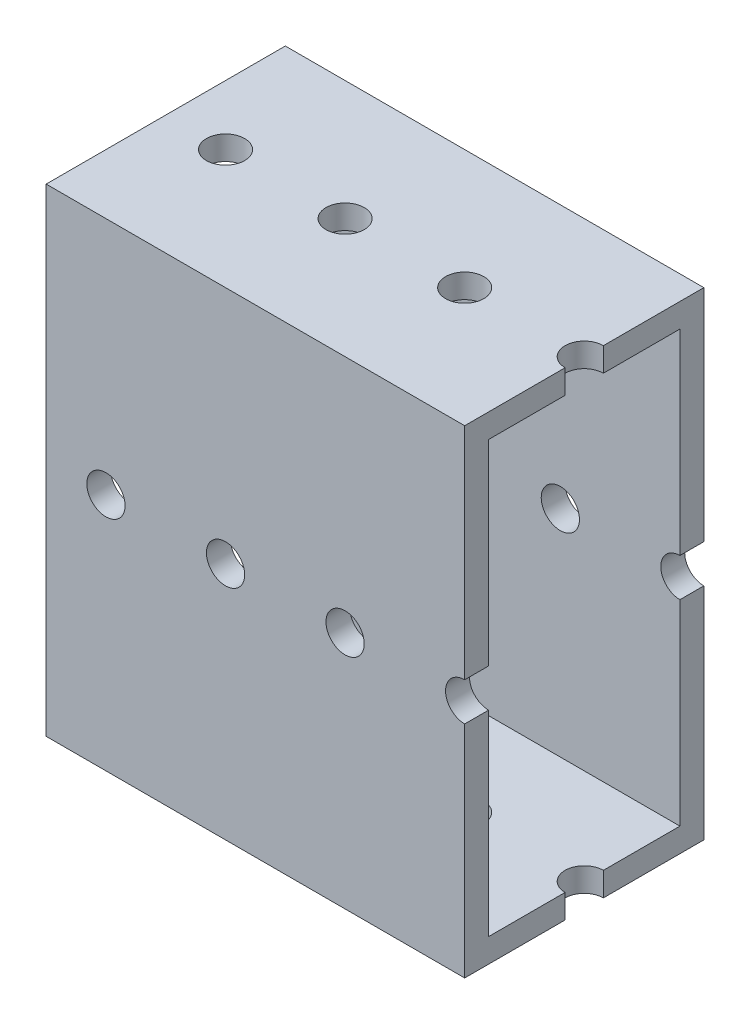
ISO-10303-21;
HEADER;
FILE_DESCRIPTION(('STEP AP214'),'2;1');
FILE_NAME('part.step','',(''),(''),'','','');
FILE_SCHEMA(('AUTOMOTIVE_DESIGN { 1 0 10303 214 1 1 1 1 }'));
ENDSEC;
DATA;
#1=APPLICATION_CONTEXT('core data for automotive mechanical design processes');
#2=APPLICATION_PROTOCOL_DEFINITION('international standard','automotive_design',2000,#1);
#3=PRODUCT_CONTEXT('',#1,'mechanical');
#4=PRODUCT('Part','Part','',(#3));
#5=PRODUCT_RELATED_PRODUCT_CATEGORY('part','',(#4));
#6=PRODUCT_DEFINITION_FORMATION('','',#4);
#7=PRODUCT_DEFINITION_CONTEXT('part definition',#1,'design');
#8=PRODUCT_DEFINITION('design','',#6,#7);
#9=PRODUCT_DEFINITION_SHAPE('','',#8);
#10=(LENGTH_UNIT() NAMED_UNIT(*) SI_UNIT(.MILLI.,.METRE.));
#11=(NAMED_UNIT(*) PLANE_ANGLE_UNIT() SI_UNIT($,.RADIAN.));
#12=(NAMED_UNIT(*) SI_UNIT($,.STERADIAN.) SOLID_ANGLE_UNIT());
#13=UNCERTAINTY_MEASURE_WITH_UNIT(LENGTH_MEASURE(1.E-05),#10,'distance_accuracy_value','');
#14=(GEOMETRIC_REPRESENTATION_CONTEXT(3) GLOBAL_UNCERTAINTY_ASSIGNED_CONTEXT((#13)) GLOBAL_UNIT_ASSIGNED_CONTEXT((#10,
#11,#12)) REPRESENTATION_CONTEXT('',''));
#15=CARTESIAN_POINT('',(0.,0.,0.));
#16=DIRECTION('',(0.,0.,1.));
#17=DIRECTION('',(1.,0.,0.));
#18=AXIS2_PLACEMENT_3D('',#15,#16,#17);
#19=CARTESIAN_POINT('',(44.45,0.,0.));
#20=DIRECTION('',(-1.,0.,0.));
#21=DIRECTION('',(0.,0.,1.));
#22=AXIS2_PLACEMENT_3D('',#19,#20,#21);
#23=PLANE('',#22);
#24=DIRECTION('',(0.,1.,0.));
#25=VECTOR('',#24,1.);
#26=CARTESIAN_POINT('',(44.45,-22.86,-10.16));
#27=LINE('',#26,#25);
#28=CARTESIAN_POINT('',(44.45,2.03200000000001,-10.16));
#29=VERTEX_POINT('',#28);
#30=CARTESIAN_POINT('',(44.45,22.86,-10.16));
#31=VERTEX_POINT('',#30);
#32=EDGE_CURVE('E284',#29,#31,#27,.T.);
#33=ORIENTED_EDGE('',*,*,#32,.F.);
#34=DIRECTION('',(0.,0.,-1.));
#35=VECTOR('',#34,1.);
#36=CARTESIAN_POINT('',(44.45,2.03200000000001,12.7));
#37=LINE('',#36,#35);
#38=CARTESIAN_POINT('',(44.45,2.03200000000001,-12.7));
#39=VERTEX_POINT('',#38);
#40=EDGE_CURVE('E54',#29,#39,#37,.T.);
#41=ORIENTED_EDGE('',*,*,#40,.T.);
#42=DIRECTION('',(0.,1.,0.));
#43=VECTOR('',#42,1.);
#44=CARTESIAN_POINT('',(44.45,-25.4,-12.7));
#45=LINE('',#44,#43);
#46=CARTESIAN_POINT('',(44.45,25.4,-12.7));
#47=VERTEX_POINT('',#46);
#48=EDGE_CURVE('E189',#39,#47,#45,.T.);
#49=ORIENTED_EDGE('',*,*,#48,.T.);
#50=DIRECTION('',(0.,0.,1.));
#51=VECTOR('',#50,1.);
#52=CARTESIAN_POINT('',(44.45,25.4,12.7));
#53=LINE('',#52,#51);
#54=CARTESIAN_POINT('',(44.45,25.4,-2.032));
#55=VERTEX_POINT('',#54);
#56=EDGE_CURVE('E173',#47,#55,#53,.T.);
#57=ORIENTED_EDGE('',*,*,#56,.T.);
#58=DIRECTION('',(0.,-1.,0.));
#59=VECTOR('',#58,1.);
#60=CARTESIAN_POINT('',(44.45,25.4,-2.032));
#61=LINE('',#60,#59);
#62=CARTESIAN_POINT('',(44.45,22.86,-2.032));
#63=VERTEX_POINT('',#62);
#64=EDGE_CURVE('E268',#55,#63,#61,.T.);
#65=ORIENTED_EDGE('',*,*,#64,.T.);
#66=DIRECTION('',(0.,0.,1.));
#67=VECTOR('',#66,1.);
#68=CARTESIAN_POINT('',(44.45,22.86,10.16));
#69=LINE('',#68,#67);
#70=EDGE_CURVE('E289',#31,#63,#69,.T.);
#71=ORIENTED_EDGE('',*,*,#70,.F.);
#72=EDGE_LOOP('',(#33,#41,#49,#57,#65,#71));
#73=FACE_BOUND('',#72,.T.);
#74=ADVANCED_FACE('F32',(#73),#23,.F.);
#75=DIRECTION('',(0.,-1.,0.));
#76=VECTOR('',#75,1.);
#77=CARTESIAN_POINT('',(44.45,-25.4,12.7));
#78=LINE('',#77,#76);
#79=CARTESIAN_POINT('',(44.45,25.4,12.7));
#80=VERTEX_POINT('',#79);
#81=CARTESIAN_POINT('',(44.45,2.03200000000001,12.7));
#82=VERTEX_POINT('',#81);
#83=EDGE_CURVE('E158',#80,#82,#78,.T.);
#84=ORIENTED_EDGE('',*,*,#83,.T.);
#85=DIRECTION('',(0.,0.,-1.));
#86=VECTOR('',#85,1.);
#87=CARTESIAN_POINT('',(44.45,2.03200000000001,12.7));
#88=LINE('',#87,#86);
#89=CARTESIAN_POINT('',(44.45,2.03200000000001,10.16));
#90=VERTEX_POINT('',#89);
#91=EDGE_CURVE('E142',#82,#90,#88,.T.);
#92=ORIENTED_EDGE('',*,*,#91,.T.);
#93=DIRECTION('',(0.,-1.,0.));
#94=VECTOR('',#93,1.);
#95=CARTESIAN_POINT('',(44.45,-22.86,10.16));
#96=LINE('',#95,#94);
#97=CARTESIAN_POINT('',(44.45,22.86,10.16));
#98=VERTEX_POINT('',#97);
#99=EDGE_CURVE('E277',#98,#90,#96,.T.);
#100=ORIENTED_EDGE('',*,*,#99,.F.);
#101=CARTESIAN_POINT('',(44.45,22.86,2.032));
#102=VERTEX_POINT('',#101);
#103=EDGE_CURVE('E288',#102,#98,#69,.T.);
#104=ORIENTED_EDGE('',*,*,#103,.F.);
#105=DIRECTION('',(0.,-1.,0.));
#106=VECTOR('',#105,1.);
#107=CARTESIAN_POINT('',(44.45,25.4,2.032));
#108=LINE('',#107,#106);
#109=CARTESIAN_POINT('',(44.45,25.4,2.032));
#110=VERTEX_POINT('',#109);
#111=EDGE_CURVE('E266',#102,#110,#108,.F.);
#112=ORIENTED_EDGE('',*,*,#111,.T.);
#113=EDGE_CURVE('E167',#110,#80,#53,.T.);
#114=ORIENTED_EDGE('',*,*,#113,.T.);
#115=EDGE_LOOP('',(#84,#92,#100,#104,#112,#114));
#116=FACE_BOUND('',#115,.T.);
#117=ADVANCED_FACE('F164',(#116),#23,.F.);
#118=CARTESIAN_POINT('',(44.45,-25.4,-12.7));
#119=VERTEX_POINT('',#118);
#120=CARTESIAN_POINT('',(44.45,-2.032,-12.7));
#121=VERTEX_POINT('',#120);
#122=EDGE_CURVE('E311',#119,#121,#45,.T.);
#123=ORIENTED_EDGE('',*,*,#122,.T.);
#124=DIRECTION('',(0.,0.,-1.));
#125=VECTOR('',#124,1.);
#126=CARTESIAN_POINT('',(44.45,-2.032,12.7));
#127=LINE('',#126,#125);
#128=CARTESIAN_POINT('',(44.45,-2.032,-10.16));
#129=VERTEX_POINT('',#128);
#130=EDGE_CURVE('E227',#121,#129,#127,.F.);
#131=ORIENTED_EDGE('',*,*,#130,.T.);
#132=CARTESIAN_POINT('',(44.45,-22.86,-10.16));
#133=VERTEX_POINT('',#132);
#134=EDGE_CURVE('E285',#133,#129,#27,.T.);
#135=ORIENTED_EDGE('',*,*,#134,.F.);
#136=DIRECTION('',(0.,0.,-1.));
#137=VECTOR('',#136,1.);
#138=CARTESIAN_POINT('',(44.45,-22.86,10.16));
#139=LINE('',#138,#137);
#140=CARTESIAN_POINT('',(44.45,-22.86,-2.032));
#141=VERTEX_POINT('',#140);
#142=EDGE_CURVE('E279',#141,#133,#139,.T.);
#143=ORIENTED_EDGE('',*,*,#142,.F.);
#144=CARTESIAN_POINT('',(44.45,-25.4,-2.032));
#145=VERTEX_POINT('',#144);
#146=EDGE_CURVE('E214',#141,#145,#61,.T.);
#147=ORIENTED_EDGE('',*,*,#146,.T.);
#148=DIRECTION('',(0.,0.,-1.));
#149=VECTOR('',#148,1.);
#150=CARTESIAN_POINT('',(44.45,-25.4,12.7));
#151=LINE('',#150,#149);
#152=EDGE_CURVE('E169',#145,#119,#151,.T.);
#153=ORIENTED_EDGE('',*,*,#152,.T.);
#154=EDGE_LOOP('',(#123,#131,#135,#143,#147,#153));
#155=FACE_BOUND('',#154,.T.);
#156=ADVANCED_FACE('F368',(#155),#23,.F.);
#157=CARTESIAN_POINT('',(44.45,-2.032,10.16));
#158=VERTEX_POINT('',#157);
#159=CARTESIAN_POINT('',(44.45,-22.86,10.16));
#160=VERTEX_POINT('',#159);
#161=EDGE_CURVE('E280',#158,#160,#96,.T.);
#162=ORIENTED_EDGE('',*,*,#161,.F.);
#163=DIRECTION('',(0.,0.,-1.));
#164=VECTOR('',#163,1.);
#165=CARTESIAN_POINT('',(44.45,-2.032,12.7));
#166=LINE('',#165,#164);
#167=CARTESIAN_POINT('',(44.45,-2.032,12.7));
#168=VERTEX_POINT('',#167);
#169=EDGE_CURVE('E47',#158,#168,#166,.F.);
#170=ORIENTED_EDGE('',*,*,#169,.T.);
#171=CARTESIAN_POINT('',(44.45,-25.4,12.7));
#172=VERTEX_POINT('',#171);
#173=EDGE_CURVE('E160',#168,#172,#78,.T.);
#174=ORIENTED_EDGE('',*,*,#173,.T.);
#175=CARTESIAN_POINT('',(44.45,-25.4,2.032));
#176=VERTEX_POINT('',#175);
#177=EDGE_CURVE('E171',#172,#176,#151,.T.);
#178=ORIENTED_EDGE('',*,*,#177,.T.);
#179=CARTESIAN_POINT('',(44.45,-22.86,2.032));
#180=VERTEX_POINT('',#179);
#181=EDGE_CURVE('E269',#176,#180,#108,.F.);
#182=ORIENTED_EDGE('',*,*,#181,.T.);
#183=EDGE_CURVE('E281',#160,#180,#139,.T.);
#184=ORIENTED_EDGE('',*,*,#183,.F.);
#185=EDGE_LOOP('',(#162,#170,#174,#178,#182,#184));
#186=FACE_BOUND('',#185,.T.);
#187=ADVANCED_FACE('F340',(#186),#23,.F.);
#188=CARTESIAN_POINT('',(0.,0.,0.));
#189=DIRECTION('',(-1.,0.,0.));
#190=DIRECTION('',(0.,0.,1.));
#191=AXIS2_PLACEMENT_3D('',#188,#189,#190);
#192=PLANE('',#191);
#193=DIRECTION('',(0.,1.,0.));
#194=VECTOR('',#193,1.);
#195=CARTESIAN_POINT('',(0.,-25.4,-12.7));
#196=LINE('',#195,#194);
#197=CARTESIAN_POINT('',(0.,-25.4,-12.7));
#198=VERTEX_POINT('',#197);
#199=CARTESIAN_POINT('',(0.,25.4,-12.7));
#200=VERTEX_POINT('',#199);
#201=EDGE_CURVE('E179',#198,#200,#196,.T.);
#202=ORIENTED_EDGE('',*,*,#201,.F.);
#203=DIRECTION('',(0.,0.,-1.));
#204=VECTOR('',#203,1.);
#205=CARTESIAN_POINT('',(0.,-25.4,12.7));
#206=LINE('',#205,#204);
#207=CARTESIAN_POINT('',(0.,-25.4,12.7));
#208=VERTEX_POINT('',#207);
#209=EDGE_CURVE('E187',#208,#198,#206,.T.);
#210=ORIENTED_EDGE('',*,*,#209,.F.);
#211=DIRECTION('',(0.,-1.,0.));
#212=VECTOR('',#211,1.);
#213=CARTESIAN_POINT('',(0.,-25.4,12.7));
#214=LINE('',#213,#212);
#215=CARTESIAN_POINT('',(0.,25.4,12.7));
#216=VERTEX_POINT('',#215);
#217=EDGE_CURVE('E185',#216,#208,#214,.T.);
#218=ORIENTED_EDGE('',*,*,#217,.F.);
#219=DIRECTION('',(0.,0.,1.));
#220=VECTOR('',#219,1.);
#221=CARTESIAN_POINT('',(0.,25.4,12.7));
#222=LINE('',#221,#220);
#223=EDGE_CURVE('E182',#200,#216,#222,.T.);
#224=ORIENTED_EDGE('',*,*,#223,.F.);
#225=EDGE_LOOP('',(#202,#210,#218,#224));
#226=FACE_BOUND('',#225,.T.);
#227=DIRECTION('',(0.,0.,1.));
#228=VECTOR('',#227,1.);
#229=CARTESIAN_POINT('',(0.,22.86,10.16));
#230=LINE('',#229,#228);
#231=CARTESIAN_POINT('',(0.,22.86,-10.16));
#232=VERTEX_POINT('',#231);
#233=CARTESIAN_POINT('',(0.,22.86,10.16));
#234=VERTEX_POINT('',#233);
#235=EDGE_CURVE('E301',#232,#234,#230,.T.);
#236=ORIENTED_EDGE('',*,*,#235,.T.);
#237=DIRECTION('',(0.,-1.,0.));
#238=VECTOR('',#237,1.);
#239=CARTESIAN_POINT('',(0.,-22.86,10.16));
#240=LINE('',#239,#238);
#241=CARTESIAN_POINT('',(0.,-22.86,10.16));
#242=VERTEX_POINT('',#241);
#243=EDGE_CURVE('E276',#234,#242,#240,.T.);
#244=ORIENTED_EDGE('',*,*,#243,.T.);
#245=DIRECTION('',(0.,0.,-1.));
#246=VECTOR('',#245,1.);
#247=CARTESIAN_POINT('',(0.,-22.86,10.16));
#248=LINE('',#247,#246);
#249=CARTESIAN_POINT('',(0.,-22.86,-10.16));
#250=VERTEX_POINT('',#249);
#251=EDGE_CURVE('E295',#242,#250,#248,.T.);
#252=ORIENTED_EDGE('',*,*,#251,.T.);
#253=DIRECTION('',(0.,1.,0.));
#254=VECTOR('',#253,1.);
#255=CARTESIAN_POINT('',(0.,-22.86,-10.16));
#256=LINE('',#255,#254);
#257=EDGE_CURVE('E298',#250,#232,#256,.T.);
#258=ORIENTED_EDGE('',*,*,#257,.T.);
#259=EDGE_LOOP('',(#236,#244,#252,#258));
#260=FACE_BOUND('',#259,.T.);
#261=ADVANCED_FACE('F329',(#226,#260),#192,.T.);
#262=CARTESIAN_POINT('',(44.45,-25.4,-12.7));
#263=DIRECTION('',(0.,0.,1.));
#264=DIRECTION('',(1.,0.,0.));
#265=AXIS2_PLACEMENT_3D('',#262,#263,#264);
#266=PLANE('',#265);
#267=CARTESIAN_POINT('',(31.75,0.,-12.7));
#268=DIRECTION('',(0.,0.,-1.));
#269=DIRECTION('',(-1.,0.,0.));
#270=AXIS2_PLACEMENT_3D('',#267,#268,#269);
#271=CIRCLE('',#270,2.03200000000001);
#272=CARTESIAN_POINT('',(29.718,0.,-12.7));
#273=VERTEX_POINT('',#272);
#274=EDGE_CURVE('E621',#273,#273,#271,.T.);
#275=ORIENTED_EDGE('',*,*,#274,.F.);
#276=EDGE_LOOP('',(#275));
#277=FACE_BOUND('',#276,.T.);
#278=CARTESIAN_POINT('',(19.05,0.,-12.7));
#279=DIRECTION('',(0.,0.,-1.));
#280=DIRECTION('',(-1.,0.,0.));
#281=AXIS2_PLACEMENT_3D('',#278,#279,#280);
#282=CIRCLE('',#281,2.032);
#283=CARTESIAN_POINT('',(17.018,0.,-12.7));
#284=VERTEX_POINT('',#283);
#285=EDGE_CURVE('E630',#284,#284,#282,.T.);
#286=ORIENTED_EDGE('',*,*,#285,.F.);
#287=EDGE_LOOP('',(#286));
#288=FACE_BOUND('',#287,.T.);
#289=CARTESIAN_POINT('',(6.35000000000002,0.,-12.7));
#290=DIRECTION('',(0.,0.,-1.));
#291=DIRECTION('',(-1.,0.,0.));
#292=AXIS2_PLACEMENT_3D('',#289,#290,#291);
#293=CIRCLE('',#292,2.032);
#294=CARTESIAN_POINT('',(4.31800000000002,0.,-12.7));
#295=VERTEX_POINT('',#294);
#296=EDGE_CURVE('E635',#295,#295,#293,.T.);
#297=ORIENTED_EDGE('',*,*,#296,.F.);
#298=EDGE_LOOP('',(#297));
#299=FACE_BOUND('',#298,.T.);
#300=ORIENTED_EDGE('',*,*,#48,.F.);
#301=CARTESIAN_POINT('',(44.45,0.,-12.7));
#302=DIRECTION('',(0.,0.,-1.));
#303=DIRECTION('',(-1.,0.,0.));
#304=AXIS2_PLACEMENT_3D('',#301,#302,#303);
#305=CIRCLE('',#304,2.03200000000001);
#306=EDGE_CURVE('E162',#121,#39,#305,.T.);
#307=ORIENTED_EDGE('',*,*,#306,.F.);
#308=ORIENTED_EDGE('',*,*,#122,.F.);
#309=DIRECTION('',(-1.,0.,0.));
#310=VECTOR('',#309,1.);
#311=CARTESIAN_POINT('',(44.45,-25.4,-12.7));
#312=LINE('',#311,#310);
#313=EDGE_CURVE('E178',#119,#198,#312,.T.);
#314=ORIENTED_EDGE('',*,*,#313,.T.);
#315=ORIENTED_EDGE('',*,*,#201,.T.);
#316=DIRECTION('',(-1.,0.,0.));
#317=VECTOR('',#316,1.);
#318=CARTESIAN_POINT('',(44.45,25.4,-12.7));
#319=LINE('',#318,#317);
#320=EDGE_CURVE('E197',#47,#200,#319,.T.);
#321=ORIENTED_EDGE('',*,*,#320,.F.);
#322=EDGE_LOOP('',(#300,#307,#308,#314,#315,#321));
#323=FACE_BOUND('',#322,.T.);
#324=ADVANCED_FACE('F34',(#277,#288,#299,#323),#266,.F.);
#325=CARTESIAN_POINT('',(44.45,25.4,12.7));
#326=DIRECTION('',(0.,-1.,0.));
#327=DIRECTION('',(0.,0.,-1.));
#328=AXIS2_PLACEMENT_3D('',#325,#326,#327);
#329=PLANE('',#328);
#330=CARTESIAN_POINT('',(6.35,25.4,0.));
#331=DIRECTION('',(0.,-1.,0.));
#332=DIRECTION('',(0.,0.,-1.));
#333=AXIS2_PLACEMENT_3D('',#330,#331,#332);
#334=CIRCLE('',#333,2.032);
#335=CARTESIAN_POINT('',(6.35,25.4,-2.032));
#336=VERTEX_POINT('',#335);
#337=EDGE_CURVE('E204',#336,#336,#334,.T.);
#338=ORIENTED_EDGE('',*,*,#337,.T.);
#339=EDGE_LOOP('',(#338));
#340=FACE_BOUND('',#339,.T.);
#341=CARTESIAN_POINT('',(31.75,25.4,0.));
#342=DIRECTION('',(0.,-1.,0.));
#343=DIRECTION('',(0.,0.,-1.));
#344=AXIS2_PLACEMENT_3D('',#341,#342,#343);
#345=CIRCLE('',#344,2.032);
#346=CARTESIAN_POINT('',(31.75,25.4,-2.032));
#347=VERTEX_POINT('',#346);
#348=EDGE_CURVE('E247',#347,#347,#345,.T.);
#349=ORIENTED_EDGE('',*,*,#348,.T.);
#350=EDGE_LOOP('',(#349));
#351=FACE_BOUND('',#350,.T.);
#352=CARTESIAN_POINT('',(19.05,25.4,0.));
#353=DIRECTION('',(0.,-1.,0.));
#354=DIRECTION('',(0.,0.,-1.));
#355=AXIS2_PLACEMENT_3D('',#352,#353,#354);
#356=CIRCLE('',#355,2.032);
#357=CARTESIAN_POINT('',(19.05,25.4,-2.032));
#358=VERTEX_POINT('',#357);
#359=EDGE_CURVE('E246',#358,#358,#356,.T.);
#360=ORIENTED_EDGE('',*,*,#359,.T.);
#361=EDGE_LOOP('',(#360));
#362=FACE_BOUND('',#361,.T.);
#363=ORIENTED_EDGE('',*,*,#113,.F.);
#364=CARTESIAN_POINT('',(44.45,25.4,0.));
#365=DIRECTION('',(0.,-1.,0.));
#366=DIRECTION('',(0.,0.,-1.));
#367=AXIS2_PLACEMENT_3D('',#364,#365,#366);
#368=CIRCLE('',#367,2.032);
#369=EDGE_CURVE('E254',#110,#55,#368,.T.);
#370=ORIENTED_EDGE('',*,*,#369,.T.);
#371=ORIENTED_EDGE('',*,*,#56,.F.);
#372=ORIENTED_EDGE('',*,*,#320,.T.);
#373=ORIENTED_EDGE('',*,*,#223,.T.);
#374=DIRECTION('',(-1.,0.,0.));
#375=VECTOR('',#374,1.);
#376=CARTESIAN_POINT('',(44.45,25.4,12.7));
#377=LINE('',#376,#375);
#378=EDGE_CURVE('E195',#80,#216,#377,.T.);
#379=ORIENTED_EDGE('',*,*,#378,.F.);
#380=EDGE_LOOP('',(#363,#370,#371,#372,#373,#379));
#381=FACE_BOUND('',#380,.T.);
#382=ADVANCED_FACE('F324',(#340,#351,#362,#381),#329,.F.);
#383=CARTESIAN_POINT('',(44.45,-25.4,12.7));
#384=DIRECTION('',(0.,0.,-1.));
#385=DIRECTION('',(-1.,0.,0.));
#386=AXIS2_PLACEMENT_3D('',#383,#384,#385);
#387=PLANE('',#386);
#388=CARTESIAN_POINT('',(31.75,0.,12.7));
#389=DIRECTION('',(0.,0.,-1.));
#390=DIRECTION('',(-1.,0.,0.));
#391=AXIS2_PLACEMENT_3D('',#388,#389,#390);
#392=CIRCLE('',#391,2.03200000000001);
#393=CARTESIAN_POINT('',(29.718,0.,12.7));
#394=VERTEX_POINT('',#393);
#395=EDGE_CURVE('E620',#394,#394,#392,.T.);
#396=ORIENTED_EDGE('',*,*,#395,.T.);
#397=EDGE_LOOP('',(#396));
#398=FACE_BOUND('',#397,.T.);
#399=CARTESIAN_POINT('',(19.05,0.,12.7));
#400=DIRECTION('',(0.,0.,-1.));
#401=DIRECTION('',(-1.,0.,0.));
#402=AXIS2_PLACEMENT_3D('',#399,#400,#401);
#403=CIRCLE('',#402,2.032);
#404=CARTESIAN_POINT('',(17.018,0.,12.7));
#405=VERTEX_POINT('',#404);
#406=EDGE_CURVE('E625',#405,#405,#403,.T.);
#407=ORIENTED_EDGE('',*,*,#406,.T.);
#408=EDGE_LOOP('',(#407));
#409=FACE_BOUND('',#408,.T.);
#410=CARTESIAN_POINT('',(6.35000000000002,0.,12.7));
#411=DIRECTION('',(0.,0.,-1.));
#412=DIRECTION('',(-1.,0.,0.));
#413=AXIS2_PLACEMENT_3D('',#410,#411,#412);
#414=CIRCLE('',#413,2.032);
#415=CARTESIAN_POINT('',(4.31800000000002,0.,12.7));
#416=VERTEX_POINT('',#415);
#417=EDGE_CURVE('E633',#416,#416,#414,.T.);
#418=ORIENTED_EDGE('',*,*,#417,.T.);
#419=EDGE_LOOP('',(#418));
#420=FACE_BOUND('',#419,.T.);
#421=ORIENTED_EDGE('',*,*,#173,.F.);
#422=CARTESIAN_POINT('',(44.45,0.,12.7));
#423=DIRECTION('',(0.,0.,-1.));
#424=DIRECTION('',(-1.,0.,0.));
#425=AXIS2_PLACEMENT_3D('',#422,#423,#424);
#426=CIRCLE('',#425,2.03200000000001);
#427=EDGE_CURVE('E145',#168,#82,#426,.T.);
#428=ORIENTED_EDGE('',*,*,#427,.T.);
#429=ORIENTED_EDGE('',*,*,#83,.F.);
#430=ORIENTED_EDGE('',*,*,#378,.T.);
#431=ORIENTED_EDGE('',*,*,#217,.T.);
#432=DIRECTION('',(-1.,0.,0.));
#433=VECTOR('',#432,1.);
#434=CARTESIAN_POINT('',(44.45,-25.4,12.7));
#435=LINE('',#434,#433);
#436=EDGE_CURVE('E192',#172,#208,#435,.T.);
#437=ORIENTED_EDGE('',*,*,#436,.F.);
#438=EDGE_LOOP('',(#421,#428,#429,#430,#431,#437));
#439=FACE_BOUND('',#438,.T.);
#440=ADVANCED_FACE('F156',(#398,#409,#420,#439),#387,.F.);
#441=CARTESIAN_POINT('',(44.45,-25.4,12.7));
#442=DIRECTION('',(0.,1.,0.));
#443=DIRECTION('',(0.,0.,1.));
#444=AXIS2_PLACEMENT_3D('',#441,#442,#443);
#445=PLANE('',#444);
#446=CARTESIAN_POINT('',(6.35,-25.4,0.));
#447=DIRECTION('',(0.,-1.,0.));
#448=DIRECTION('',(0.,0.,-1.));
#449=AXIS2_PLACEMENT_3D('',#446,#447,#448);
#450=CIRCLE('',#449,2.032);
#451=CARTESIAN_POINT('',(6.35,-25.4,-2.032));
#452=VERTEX_POINT('',#451);
#453=EDGE_CURVE('E243',#452,#452,#450,.T.);
#454=ORIENTED_EDGE('',*,*,#453,.F.);
#455=EDGE_LOOP('',(#454));
#456=FACE_BOUND('',#455,.T.);
#457=CARTESIAN_POINT('',(31.75,-25.4,0.));
#458=DIRECTION('',(0.,-1.,0.));
#459=DIRECTION('',(0.,0.,-1.));
#460=AXIS2_PLACEMENT_3D('',#457,#458,#459);
#461=CIRCLE('',#460,2.032);
#462=CARTESIAN_POINT('',(31.75,-25.4,-2.032));
#463=VERTEX_POINT('',#462);
#464=EDGE_CURVE('E251',#463,#463,#461,.T.);
#465=ORIENTED_EDGE('',*,*,#464,.F.);
#466=EDGE_LOOP('',(#465));
#467=FACE_BOUND('',#466,.T.);
#468=CARTESIAN_POINT('',(19.05,-25.4,0.));
#469=DIRECTION('',(0.,-1.,0.));
#470=DIRECTION('',(0.,0.,-1.));
#471=AXIS2_PLACEMENT_3D('',#468,#469,#470);
#472=CIRCLE('',#471,2.032);
#473=CARTESIAN_POINT('',(19.05,-25.4,-2.032));
#474=VERTEX_POINT('',#473);
#475=EDGE_CURVE('E250',#474,#474,#472,.T.);
#476=ORIENTED_EDGE('',*,*,#475,.F.);
#477=EDGE_LOOP('',(#476));
#478=FACE_BOUND('',#477,.T.);
#479=ORIENTED_EDGE('',*,*,#152,.F.);
#480=CARTESIAN_POINT('',(44.45,-25.4,0.));
#481=DIRECTION('',(0.,-1.,0.));
#482=DIRECTION('',(0.,0.,-1.));
#483=AXIS2_PLACEMENT_3D('',#480,#481,#482);
#484=CIRCLE('',#483,2.032);
#485=EDGE_CURVE('E151',#176,#145,#484,.T.);
#486=ORIENTED_EDGE('',*,*,#485,.F.);
#487=ORIENTED_EDGE('',*,*,#177,.F.);
#488=ORIENTED_EDGE('',*,*,#436,.T.);
#489=ORIENTED_EDGE('',*,*,#209,.T.);
#490=ORIENTED_EDGE('',*,*,#313,.F.);
#491=EDGE_LOOP('',(#479,#486,#487,#488,#489,#490));
#492=FACE_BOUND('',#491,.T.);
#493=ADVANCED_FACE('F335',(#456,#467,#478,#492),#445,.F.);
#494=CARTESIAN_POINT('',(44.45,-22.86,10.16));
#495=DIRECTION('',(0.,0.,-1.));
#496=DIRECTION('',(-1.,0.,0.));
#497=AXIS2_PLACEMENT_3D('',#494,#495,#496);
#498=PLANE('',#497);
#499=CARTESIAN_POINT('',(44.45,0.,10.16));
#500=DIRECTION('',(0.,0.,-1.));
#501=DIRECTION('',(-1.,0.,0.));
#502=AXIS2_PLACEMENT_3D('',#499,#500,#501);
#503=CIRCLE('',#502,2.03200000000001);
#504=EDGE_CURVE('E146',#158,#90,#503,.T.);
#505=ORIENTED_EDGE('',*,*,#504,.F.);
#506=ORIENTED_EDGE('',*,*,#161,.T.);
#507=DIRECTION('',(-1.,0.,0.));
#508=VECTOR('',#507,1.);
#509=CARTESIAN_POINT('',(44.45,-22.86,10.16));
#510=LINE('',#509,#508);
#511=EDGE_CURVE('E183',#160,#242,#510,.T.);
#512=ORIENTED_EDGE('',*,*,#511,.T.);
#513=ORIENTED_EDGE('',*,*,#243,.F.);
#514=DIRECTION('',(-1.,0.,0.));
#515=VECTOR('',#514,1.);
#516=CARTESIAN_POINT('',(44.45,22.86,10.16));
#517=LINE('',#516,#515);
#518=EDGE_CURVE('E292',#98,#234,#517,.T.);
#519=ORIENTED_EDGE('',*,*,#518,.F.);
#520=ORIENTED_EDGE('',*,*,#99,.T.);
#521=EDGE_LOOP('',(#505,#506,#512,#513,#519,#520));
#522=FACE_BOUND('',#521,.T.);
#523=CARTESIAN_POINT('',(31.75,0.,10.16));
#524=DIRECTION('',(0.,0.,-1.));
#525=DIRECTION('',(-1.,0.,0.));
#526=AXIS2_PLACEMENT_3D('',#523,#524,#525);
#527=CIRCLE('',#526,2.03200000000001);
#528=CARTESIAN_POINT('',(29.718,0.,10.16));
#529=VERTEX_POINT('',#528);
#530=EDGE_CURVE('E223',#529,#529,#527,.T.);
#531=ORIENTED_EDGE('',*,*,#530,.F.);
#532=EDGE_LOOP('',(#531));
#533=FACE_BOUND('',#532,.T.);
#534=CARTESIAN_POINT('',(19.05,0.,10.16));
#535=DIRECTION('',(0.,0.,-1.));
#536=DIRECTION('',(-1.,0.,0.));
#537=AXIS2_PLACEMENT_3D('',#534,#535,#536);
#538=CIRCLE('',#537,2.032);
#539=CARTESIAN_POINT('',(17.018,0.,10.16));
#540=VERTEX_POINT('',#539);
#541=EDGE_CURVE('E220',#540,#540,#538,.T.);
#542=ORIENTED_EDGE('',*,*,#541,.F.);
#543=EDGE_LOOP('',(#542));
#544=FACE_BOUND('',#543,.T.);
#545=CARTESIAN_POINT('',(6.35000000000002,0.,10.16));
#546=DIRECTION('',(0.,0.,-1.));
#547=DIRECTION('',(-1.,0.,0.));
#548=AXIS2_PLACEMENT_3D('',#545,#546,#547);
#549=CIRCLE('',#548,2.032);
#550=CARTESIAN_POINT('',(4.31800000000002,0.,10.16));
#551=VERTEX_POINT('',#550);
#552=EDGE_CURVE('E217',#551,#551,#549,.T.);
#553=ORIENTED_EDGE('',*,*,#552,.F.);
#554=EDGE_LOOP('',(#553));
#555=FACE_BOUND('',#554,.T.);
#556=ADVANCED_FACE('F344',(#522,#533,#544,#555),#498,.T.);
#557=CARTESIAN_POINT('',(44.45,-22.86,10.16));
#558=DIRECTION('',(0.,1.,0.));
#559=DIRECTION('',(0.,0.,1.));
#560=AXIS2_PLACEMENT_3D('',#557,#558,#559);
#561=PLANE('',#560);
#562=CARTESIAN_POINT('',(6.35,-22.86,0.));
#563=DIRECTION('',(0.,1.,0.));
#564=DIRECTION('',(0.,0.,1.));
#565=AXIS2_PLACEMENT_3D('',#562,#563,#564);
#566=CIRCLE('',#565,2.032);
#567=CARTESIAN_POINT('',(6.35,-22.86,2.032));
#568=VERTEX_POINT('',#567);
#569=EDGE_CURVE('E213',#568,#568,#566,.T.);
#570=ORIENTED_EDGE('',*,*,#569,.F.);
#571=EDGE_LOOP('',(#570));
#572=FACE_BOUND('',#571,.T.);
#573=CARTESIAN_POINT('',(44.45,-22.86,0.));
#574=DIRECTION('',(0.,1.,0.));
#575=DIRECTION('',(0.,0.,1.));
#576=AXIS2_PLACEMENT_3D('',#573,#574,#575);
#577=CIRCLE('',#576,2.032);
#578=EDGE_CURVE('E272',#141,#180,#577,.T.);
#579=ORIENTED_EDGE('',*,*,#578,.F.);
#580=ORIENTED_EDGE('',*,*,#142,.T.);
#581=DIRECTION('',(-1.,0.,0.));
#582=VECTOR('',#581,1.);
#583=CARTESIAN_POINT('',(44.45,-22.86,-10.16));
#584=LINE('',#583,#582);
#585=EDGE_CURVE('E308',#133,#250,#584,.T.);
#586=ORIENTED_EDGE('',*,*,#585,.T.);
#587=ORIENTED_EDGE('',*,*,#251,.F.);
#588=ORIENTED_EDGE('',*,*,#511,.F.);
#589=ORIENTED_EDGE('',*,*,#183,.T.);
#590=EDGE_LOOP('',(#579,#580,#586,#587,#588,#589));
#591=FACE_BOUND('',#590,.T.);
#592=CARTESIAN_POINT('',(31.75,-22.86,0.));
#593=DIRECTION('',(0.,1.,0.));
#594=DIRECTION('',(0.,0.,1.));
#595=AXIS2_PLACEMENT_3D('',#592,#593,#594);
#596=CIRCLE('',#595,2.032);
#597=CARTESIAN_POINT('',(31.75,-22.86,2.032));
#598=VERTEX_POINT('',#597);
#599=EDGE_CURVE('E208',#598,#598,#596,.T.);
#600=ORIENTED_EDGE('',*,*,#599,.F.);
#601=EDGE_LOOP('',(#600));
#602=FACE_BOUND('',#601,.T.);
#603=CARTESIAN_POINT('',(19.05,-22.86,0.));
#604=DIRECTION('',(0.,1.,0.));
#605=DIRECTION('',(0.,0.,1.));
#606=AXIS2_PLACEMENT_3D('',#603,#604,#605);
#607=CIRCLE('',#606,2.032);
#608=CARTESIAN_POINT('',(19.05,-22.86,2.032));
#609=VERTEX_POINT('',#608);
#610=EDGE_CURVE('E203',#609,#609,#607,.T.);
#611=ORIENTED_EDGE('',*,*,#610,.F.);
#612=EDGE_LOOP('',(#611));
#613=FACE_BOUND('',#612,.T.);
#614=ADVANCED_FACE('F348',(#572,#591,#602,#613),#561,.T.);
#615=CARTESIAN_POINT('',(44.45,-22.86,-10.16));
#616=DIRECTION('',(0.,0.,1.));
#617=DIRECTION('',(1.,0.,0.));
#618=AXIS2_PLACEMENT_3D('',#615,#616,#617);
#619=PLANE('',#618);
#620=CARTESIAN_POINT('',(44.45,0.,-10.16));
#621=DIRECTION('',(0.,0.,1.));
#622=DIRECTION('',(1.,0.,0.));
#623=AXIS2_PLACEMENT_3D('',#620,#621,#622);
#624=CIRCLE('',#623,2.03200000000001);
#625=EDGE_CURVE('E11',#29,#129,#624,.T.);
#626=ORIENTED_EDGE('',*,*,#625,.F.);
#627=ORIENTED_EDGE('',*,*,#32,.T.);
#628=DIRECTION('',(-1.,0.,0.));
#629=VECTOR('',#628,1.);
#630=CARTESIAN_POINT('',(44.45,22.86,-10.16));
#631=LINE('',#630,#629);
#632=EDGE_CURVE('E306',#31,#232,#631,.T.);
#633=ORIENTED_EDGE('',*,*,#632,.T.);
#634=ORIENTED_EDGE('',*,*,#257,.F.);
#635=ORIENTED_EDGE('',*,*,#585,.F.);
#636=ORIENTED_EDGE('',*,*,#134,.T.);
#637=EDGE_LOOP('',(#626,#627,#633,#634,#635,#636));
#638=FACE_BOUND('',#637,.T.);
#639=CARTESIAN_POINT('',(31.75,0.,-10.16));
#640=DIRECTION('',(0.,0.,1.));
#641=DIRECTION('',(1.,0.,0.));
#642=AXIS2_PLACEMENT_3D('',#639,#640,#641);
#643=CIRCLE('',#642,2.03200000000001);
#644=CARTESIAN_POINT('',(33.782,0.,-10.16));
#645=VERTEX_POINT('',#644);
#646=EDGE_CURVE('E221',#645,#645,#643,.T.);
#647=ORIENTED_EDGE('',*,*,#646,.F.);
#648=EDGE_LOOP('',(#647));
#649=FACE_BOUND('',#648,.T.);
#650=CARTESIAN_POINT('',(19.05,0.,-10.16));
#651=DIRECTION('',(0.,0.,1.));
#652=DIRECTION('',(1.,0.,0.));
#653=AXIS2_PLACEMENT_3D('',#650,#651,#652);
#654=CIRCLE('',#653,2.032);
#655=CARTESIAN_POINT('',(21.082,0.,-10.16));
#656=VERTEX_POINT('',#655);
#657=EDGE_CURVE('E218',#656,#656,#654,.T.);
#658=ORIENTED_EDGE('',*,*,#657,.F.);
#659=EDGE_LOOP('',(#658));
#660=FACE_BOUND('',#659,.T.);
#661=CARTESIAN_POINT('',(6.35000000000002,0.,-10.16));
#662=DIRECTION('',(0.,0.,1.));
#663=DIRECTION('',(1.,0.,0.));
#664=AXIS2_PLACEMENT_3D('',#661,#662,#663);
#665=CIRCLE('',#664,2.032);
#666=CARTESIAN_POINT('',(8.38200000000002,0.,-10.16));
#667=VERTEX_POINT('',#666);
#668=EDGE_CURVE('E161',#667,#667,#665,.T.);
#669=ORIENTED_EDGE('',*,*,#668,.F.);
#670=EDGE_LOOP('',(#669));
#671=FACE_BOUND('',#670,.T.);
#672=ADVANCED_FACE('F364',(#638,#649,#660,#671),#619,.T.);
#673=CARTESIAN_POINT('',(44.45,22.86,10.16));
#674=DIRECTION('',(0.,-1.,0.));
#675=DIRECTION('',(0.,0.,-1.));
#676=AXIS2_PLACEMENT_3D('',#673,#674,#675);
#677=PLANE('',#676);
#678=CARTESIAN_POINT('',(6.35,22.86,0.));
#679=DIRECTION('',(0.,-1.,0.));
#680=DIRECTION('',(0.,0.,-1.));
#681=AXIS2_PLACEMENT_3D('',#678,#679,#680);
#682=CIRCLE('',#681,2.032);
#683=CARTESIAN_POINT('',(6.35,22.86,-2.032));
#684=VERTEX_POINT('',#683);
#685=EDGE_CURVE('E210',#684,#684,#682,.T.);
#686=ORIENTED_EDGE('',*,*,#685,.F.);
#687=EDGE_LOOP('',(#686));
#688=FACE_BOUND('',#687,.T.);
#689=CARTESIAN_POINT('',(44.45,22.86,0.));
#690=DIRECTION('',(0.,-1.,0.));
#691=DIRECTION('',(0.,0.,-1.));
#692=AXIS2_PLACEMENT_3D('',#689,#690,#691);
#693=CIRCLE('',#692,2.032);
#694=EDGE_CURVE('E40',#102,#63,#693,.T.);
#695=ORIENTED_EDGE('',*,*,#694,.F.);
#696=ORIENTED_EDGE('',*,*,#103,.T.);
#697=ORIENTED_EDGE('',*,*,#518,.T.);
#698=ORIENTED_EDGE('',*,*,#235,.F.);
#699=ORIENTED_EDGE('',*,*,#632,.F.);
#700=ORIENTED_EDGE('',*,*,#70,.T.);
#701=EDGE_LOOP('',(#695,#696,#697,#698,#699,#700));
#702=FACE_BOUND('',#701,.T.);
#703=CARTESIAN_POINT('',(31.75,22.86,0.));
#704=DIRECTION('',(0.,-1.,0.));
#705=DIRECTION('',(0.,0.,-1.));
#706=AXIS2_PLACEMENT_3D('',#703,#704,#705);
#707=CIRCLE('',#706,2.032);
#708=CARTESIAN_POINT('',(31.75,22.86,-2.032));
#709=VERTEX_POINT('',#708);
#710=EDGE_CURVE('E205',#709,#709,#707,.T.);
#711=ORIENTED_EDGE('',*,*,#710,.F.);
#712=EDGE_LOOP('',(#711));
#713=FACE_BOUND('',#712,.T.);
#714=CARTESIAN_POINT('',(19.05,22.86,0.));
#715=DIRECTION('',(0.,-1.,0.));
#716=DIRECTION('',(0.,0.,-1.));
#717=AXIS2_PLACEMENT_3D('',#714,#715,#716);
#718=CIRCLE('',#717,2.032);
#719=CARTESIAN_POINT('',(19.05,22.86,-2.032));
#720=VERTEX_POINT('',#719);
#721=EDGE_CURVE('E200',#720,#720,#718,.T.);
#722=ORIENTED_EDGE('',*,*,#721,.F.);
#723=EDGE_LOOP('',(#722));
#724=FACE_BOUND('',#723,.T.);
#725=ADVANCED_FACE('F356',(#688,#702,#713,#724),#677,.T.);
#726=CARTESIAN_POINT('',(19.05,25.4,0.));
#727=DIRECTION('',(0.,-1.,0.));
#728=DIRECTION('',(0.,0.,-1.));
#729=AXIS2_PLACEMENT_3D('',#726,#727,#728);
#730=CYLINDRICAL_SURFACE('',#729,2.032);
#731=ORIENTED_EDGE('',*,*,#721,.T.);
#732=EDGE_LOOP('',(#731));
#733=FACE_BOUND('',#732,.T.);
#734=ORIENTED_EDGE('',*,*,#359,.F.);
#735=EDGE_LOOP('',(#734));
#736=FACE_BOUND('',#735,.T.);
#737=ADVANCED_FACE('F441',(#733,#736),#730,.F.);
#738=CARTESIAN_POINT('',(31.75,25.4,0.));
#739=DIRECTION('',(0.,-1.,0.));
#740=DIRECTION('',(0.,0.,-1.));
#741=AXIS2_PLACEMENT_3D('',#738,#739,#740);
#742=CYLINDRICAL_SURFACE('',#741,2.032);
#743=ORIENTED_EDGE('',*,*,#710,.T.);
#744=EDGE_LOOP('',(#743));
#745=FACE_BOUND('',#744,.T.);
#746=ORIENTED_EDGE('',*,*,#348,.F.);
#747=EDGE_LOOP('',(#746));
#748=FACE_BOUND('',#747,.T.);
#749=ADVANCED_FACE('F388',(#745,#748),#742,.F.);
#750=CARTESIAN_POINT('',(44.45,25.4,0.));
#751=DIRECTION('',(0.,-1.,0.));
#752=DIRECTION('',(0.,0.,-1.));
#753=AXIS2_PLACEMENT_3D('',#750,#751,#752);
#754=CYLINDRICAL_SURFACE('',#753,2.032);
#755=ORIENTED_EDGE('',*,*,#369,.F.);
#756=ORIENTED_EDGE('',*,*,#111,.F.);
#757=ORIENTED_EDGE('',*,*,#694,.T.);
#758=ORIENTED_EDGE('',*,*,#64,.F.);
#759=EDGE_LOOP('',(#755,#756,#757,#758));
#760=FACE_BOUND('',#759,.T.);
#761=ADVANCED_FACE('F361',(#760),#754,.F.);
#762=CARTESIAN_POINT('',(6.35,25.4,0.));
#763=DIRECTION('',(0.,-1.,0.));
#764=DIRECTION('',(0.,0.,-1.));
#765=AXIS2_PLACEMENT_3D('',#762,#763,#764);
#766=CYLINDRICAL_SURFACE('',#765,2.032);
#767=ORIENTED_EDGE('',*,*,#685,.T.);
#768=EDGE_LOOP('',(#767));
#769=FACE_BOUND('',#768,.T.);
#770=ORIENTED_EDGE('',*,*,#337,.F.);
#771=EDGE_LOOP('',(#770));
#772=FACE_BOUND('',#771,.T.);
#773=ADVANCED_FACE('F384',(#769,#772),#766,.F.);
#774=ORIENTED_EDGE('',*,*,#610,.T.);
#775=EDGE_LOOP('',(#774));
#776=FACE_BOUND('',#775,.T.);
#777=ORIENTED_EDGE('',*,*,#475,.T.);
#778=EDGE_LOOP('',(#777));
#779=FACE_BOUND('',#778,.T.);
#780=ADVANCED_FACE('F385',(#776,#779),#730,.F.);
#781=ORIENTED_EDGE('',*,*,#599,.T.);
#782=EDGE_LOOP('',(#781));
#783=FACE_BOUND('',#782,.T.);
#784=ORIENTED_EDGE('',*,*,#464,.T.);
#785=EDGE_LOOP('',(#784));
#786=FACE_BOUND('',#785,.T.);
#787=ADVANCED_FACE('F375',(#783,#786),#742,.F.);
#788=ORIENTED_EDGE('',*,*,#578,.T.);
#789=ORIENTED_EDGE('',*,*,#181,.F.);
#790=ORIENTED_EDGE('',*,*,#485,.T.);
#791=ORIENTED_EDGE('',*,*,#146,.F.);
#792=EDGE_LOOP('',(#788,#789,#790,#791));
#793=FACE_BOUND('',#792,.T.);
#794=ADVANCED_FACE('F372',(#793),#754,.F.);
#795=ORIENTED_EDGE('',*,*,#569,.T.);
#796=EDGE_LOOP('',(#795));
#797=FACE_BOUND('',#796,.T.);
#798=ORIENTED_EDGE('',*,*,#453,.T.);
#799=EDGE_LOOP('',(#798));
#800=FACE_BOUND('',#799,.T.);
#801=ADVANCED_FACE('F374',(#797,#800),#766,.F.);
#802=CARTESIAN_POINT('',(6.35000000000002,0.,12.7));
#803=DIRECTION('',(0.,0.,-1.));
#804=DIRECTION('',(-1.,0.,0.));
#805=AXIS2_PLACEMENT_3D('',#802,#803,#804);
#806=CYLINDRICAL_SURFACE('',#805,2.032);
#807=ORIENTED_EDGE('',*,*,#668,.T.);
#808=EDGE_LOOP('',(#807));
#809=FACE_BOUND('',#808,.T.);
#810=ORIENTED_EDGE('',*,*,#296,.T.);
#811=EDGE_LOOP('',(#810));
#812=FACE_BOUND('',#811,.T.);
#813=ADVANCED_FACE('F381',(#809,#812),#806,.F.);
#814=CARTESIAN_POINT('',(19.05,0.,12.7));
#815=DIRECTION('',(0.,0.,-1.));
#816=DIRECTION('',(-1.,0.,0.));
#817=AXIS2_PLACEMENT_3D('',#814,#815,#816);
#818=CYLINDRICAL_SURFACE('',#817,2.032);
#819=ORIENTED_EDGE('',*,*,#657,.T.);
#820=EDGE_LOOP('',(#819));
#821=FACE_BOUND('',#820,.T.);
#822=ORIENTED_EDGE('',*,*,#285,.T.);
#823=EDGE_LOOP('',(#822));
#824=FACE_BOUND('',#823,.T.);
#825=ADVANCED_FACE('F552',(#821,#824),#818,.F.);
#826=CARTESIAN_POINT('',(31.75,0.,12.7));
#827=DIRECTION('',(0.,0.,-1.));
#828=DIRECTION('',(-1.,0.,0.));
#829=AXIS2_PLACEMENT_3D('',#826,#827,#828);
#830=CYLINDRICAL_SURFACE('',#829,2.03200000000001);
#831=ORIENTED_EDGE('',*,*,#646,.T.);
#832=EDGE_LOOP('',(#831));
#833=FACE_BOUND('',#832,.T.);
#834=ORIENTED_EDGE('',*,*,#274,.T.);
#835=EDGE_LOOP('',(#834));
#836=FACE_BOUND('',#835,.T.);
#837=ADVANCED_FACE('F563',(#833,#836),#830,.F.);
#838=CARTESIAN_POINT('',(44.45,0.,12.7));
#839=DIRECTION('',(0.,0.,-1.));
#840=DIRECTION('',(-1.,0.,0.));
#841=AXIS2_PLACEMENT_3D('',#838,#839,#840);
#842=CYLINDRICAL_SURFACE('',#841,2.03200000000001);
#843=ORIENTED_EDGE('',*,*,#625,.T.);
#844=ORIENTED_EDGE('',*,*,#130,.F.);
#845=ORIENTED_EDGE('',*,*,#306,.T.);
#846=ORIENTED_EDGE('',*,*,#40,.F.);
#847=EDGE_LOOP('',(#843,#844,#845,#846));
#848=FACE_BOUND('',#847,.T.);
#849=ADVANCED_FACE('F367',(#848),#842,.F.);
#850=ORIENTED_EDGE('',*,*,#552,.T.);
#851=EDGE_LOOP('',(#850));
#852=FACE_BOUND('',#851,.T.);
#853=ORIENTED_EDGE('',*,*,#417,.F.);
#854=EDGE_LOOP('',(#853));
#855=FACE_BOUND('',#854,.T.);
#856=ADVANCED_FACE('F555',(#852,#855),#806,.F.);
#857=ORIENTED_EDGE('',*,*,#541,.T.);
#858=EDGE_LOOP('',(#857));
#859=FACE_BOUND('',#858,.T.);
#860=ORIENTED_EDGE('',*,*,#406,.F.);
#861=EDGE_LOOP('',(#860));
#862=FACE_BOUND('',#861,.T.);
#863=ADVANCED_FACE('F566',(#859,#862),#818,.F.);
#864=ORIENTED_EDGE('',*,*,#530,.T.);
#865=EDGE_LOOP('',(#864));
#866=FACE_BOUND('',#865,.T.);
#867=ORIENTED_EDGE('',*,*,#395,.F.);
#868=EDGE_LOOP('',(#867));
#869=FACE_BOUND('',#868,.T.);
#870=ADVANCED_FACE('F575',(#866,#869),#830,.F.);
#871=ORIENTED_EDGE('',*,*,#427,.F.);
#872=ORIENTED_EDGE('',*,*,#169,.F.);
#873=ORIENTED_EDGE('',*,*,#504,.T.);
#874=ORIENTED_EDGE('',*,*,#91,.F.);
#875=EDGE_LOOP('',(#871,#872,#873,#874));
#876=FACE_BOUND('',#875,.T.);
#877=ADVANCED_FACE('F144',(#876),#842,.F.);
#878=CLOSED_SHELL('',(#74,#117,#156,#187,#261,#324,#382,#440,#493,#556,#614,#672,#725,#737,#749,
#761,#773,#780,#787,#794,#801,#813,#825,#837,#849,#856,#863,#870,#877));
#879=MANIFOLD_SOLID_BREP('B2',#878);
#880=ADVANCED_BREP_SHAPE_REPRESENTATION('',(#18,#879),#14);
#881=SHAPE_DEFINITION_REPRESENTATION(#9,#880);
ENDSEC;
END-ISO-10303-21;
